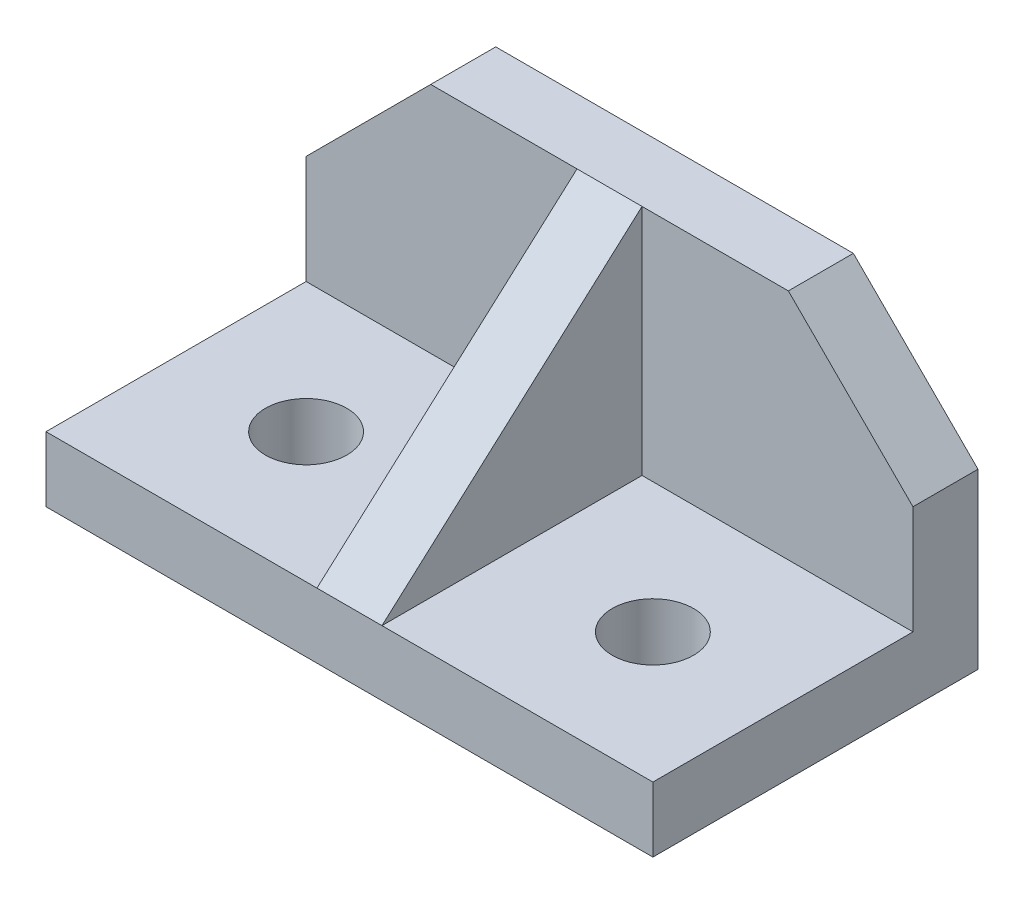
ISO-10303-21;
HEADER;
FILE_DESCRIPTION(('STEP AP214'),'2;1');
FILE_NAME('part.step','',(''),(''),'','','');
FILE_SCHEMA(('AUTOMOTIVE_DESIGN { 1 0 10303 214 1 1 1 1 }'));
ENDSEC;
DATA;
#1=APPLICATION_CONTEXT('core data for automotive mechanical design processes');
#2=APPLICATION_PROTOCOL_DEFINITION('international standard','automotive_design',2000,#1);
#3=PRODUCT_CONTEXT('',#1,'mechanical');
#4=PRODUCT('Part','Part','',(#3));
#5=PRODUCT_RELATED_PRODUCT_CATEGORY('part','',(#4));
#6=PRODUCT_DEFINITION_FORMATION('','',#4);
#7=PRODUCT_DEFINITION_CONTEXT('part definition',#1,'design');
#8=PRODUCT_DEFINITION('design','',#6,#7);
#9=PRODUCT_DEFINITION_SHAPE('','',#8);
#10=(LENGTH_UNIT() NAMED_UNIT(*) SI_UNIT(.MILLI.,.METRE.));
#11=(NAMED_UNIT(*) PLANE_ANGLE_UNIT() SI_UNIT($,.RADIAN.));
#12=(NAMED_UNIT(*) SI_UNIT($,.STERADIAN.) SOLID_ANGLE_UNIT());
#13=UNCERTAINTY_MEASURE_WITH_UNIT(LENGTH_MEASURE(1.E-05),#10,'distance_accuracy_value','');
#14=(GEOMETRIC_REPRESENTATION_CONTEXT(3) GLOBAL_UNCERTAINTY_ASSIGNED_CONTEXT((#13)) GLOBAL_UNIT_ASSIGNED_CONTEXT((#10,
#11,#12)) REPRESENTATION_CONTEXT('',''));
#15=CARTESIAN_POINT('',(0.,0.,0.));
#16=DIRECTION('',(0.,0.,1.));
#17=DIRECTION('',(1.,0.,0.));
#18=AXIS2_PLACEMENT_3D('',#15,#16,#17);
#19=CARTESIAN_POINT('',(0.,12.,0.));
#20=DIRECTION('',(0.,-1.,0.));
#21=DIRECTION('',(0.,0.,-1.));
#22=AXIS2_PLACEMENT_3D('',#19,#20,#21);
#23=PLANE('',#22);
#24=CARTESIAN_POINT('',(24.,12.,-24.));
#25=DIRECTION('',(0.,1.,0.));
#26=DIRECTION('',(0.,0.,1.));
#27=AXIS2_PLACEMENT_3D('',#24,#25,#26);
#28=CIRCLE('',#27,7.5);
#29=CARTESIAN_POINT('',(24.,12.,-16.5));
#30=VERTEX_POINT('',#29);
#31=EDGE_CURVE('E116',#30,#30,#28,.T.);
#32=ORIENTED_EDGE('',*,*,#31,.F.);
#33=EDGE_LOOP('',(#32));
#34=FACE_BOUND('',#33,.T.);
#35=DIRECTION('',(0.,0.,1.));
#36=VECTOR('',#35,1.);
#37=CARTESIAN_POINT('',(50.,12.,-48.));
#38=LINE('',#37,#36);
#39=CARTESIAN_POINT('',(50.,12.,-48.));
#40=VERTEX_POINT('',#39);
#41=CARTESIAN_POINT('',(50.,12.,0.));
#42=VERTEX_POINT('',#41);
#43=EDGE_CURVE('E425',#40,#42,#38,.T.);
#44=ORIENTED_EDGE('',*,*,#43,.F.);
#45=DIRECTION('',(-1.,0.,0.));
#46=VECTOR('',#45,1.);
#47=CARTESIAN_POINT('',(112.,12.,-48.));
#48=LINE('',#47,#46);
#49=CARTESIAN_POINT('',(0.,12.,-48.));
#50=VERTEX_POINT('',#49);
#51=EDGE_CURVE('E55',#40,#50,#48,.T.);
#52=ORIENTED_EDGE('',*,*,#51,.T.);
#53=DIRECTION('',(0.,0.,1.));
#54=VECTOR('',#53,1.);
#55=CARTESIAN_POINT('',(0.,12.,0.));
#56=LINE('',#55,#54);
#57=CARTESIAN_POINT('',(0.,12.,0.));
#58=VERTEX_POINT('',#57);
#59=EDGE_CURVE('E98',#50,#58,#56,.T.);
#60=ORIENTED_EDGE('',*,*,#59,.T.);
#61=DIRECTION('',(1.,0.,0.));
#62=VECTOR('',#61,1.);
#63=CARTESIAN_POINT('',(0.,12.,0.));
#64=LINE('',#63,#62);
#65=EDGE_CURVE('E142',#58,#42,#64,.T.);
#66=ORIENTED_EDGE('',*,*,#65,.T.);
#67=EDGE_LOOP('',(#44,#52,#60,#66));
#68=FACE_BOUND('',#67,.T.);
#69=ADVANCED_FACE('F39',(#34,#68),#23,.F.);
#70=CARTESIAN_POINT('',(88.,12.,-24.));
#71=DIRECTION('',(0.,1.,0.));
#72=DIRECTION('',(0.,0.,1.));
#73=AXIS2_PLACEMENT_3D('',#70,#71,#72);
#74=CIRCLE('',#73,7.50000000000001);
#75=CARTESIAN_POINT('',(88.,12.,-16.5));
#76=VERTEX_POINT('',#75);
#77=EDGE_CURVE('E240',#76,#76,#74,.T.);
#78=ORIENTED_EDGE('',*,*,#77,.F.);
#79=EDGE_LOOP('',(#78));
#80=FACE_BOUND('',#79,.T.);
#81=DIRECTION('',(0.,0.,-1.));
#82=VECTOR('',#81,1.);
#83=CARTESIAN_POINT('',(62.,12.,0.));
#84=LINE('',#83,#82);
#85=CARTESIAN_POINT('',(62.,12.,0.));
#86=VERTEX_POINT('',#85);
#87=CARTESIAN_POINT('',(62.,12.,-48.));
#88=VERTEX_POINT('',#87);
#89=EDGE_CURVE('E420',#86,#88,#84,.T.);
#90=ORIENTED_EDGE('',*,*,#89,.F.);
#91=CARTESIAN_POINT('',(112.,12.,0.));
#92=VERTEX_POINT('',#91);
#93=EDGE_CURVE('E64',#86,#92,#64,.T.);
#94=ORIENTED_EDGE('',*,*,#93,.T.);
#95=DIRECTION('',(0.,0.,-1.));
#96=VECTOR('',#95,1.);
#97=CARTESIAN_POINT('',(112.,12.,0.));
#98=LINE('',#97,#96);
#99=CARTESIAN_POINT('',(112.,12.,-48.));
#100=VERTEX_POINT('',#99);
#101=EDGE_CURVE('E110',#92,#100,#98,.T.);
#102=ORIENTED_EDGE('',*,*,#101,.T.);
#103=EDGE_CURVE('E157',#100,#88,#48,.T.);
#104=ORIENTED_EDGE('',*,*,#103,.T.);
#105=EDGE_LOOP('',(#90,#94,#102,#104));
#106=FACE_BOUND('',#105,.T.);
#107=ADVANCED_FACE('F154',(#80,#106),#23,.F.);
#108=CARTESIAN_POINT('',(0.,0.,-48.));
#109=DIRECTION('',(0.,0.,-1.));
#110=DIRECTION('',(-1.,0.,0.));
#111=AXIS2_PLACEMENT_3D('',#108,#109,#110);
#112=PLANE('',#111);
#113=DIRECTION('',(0.,-1.,0.));
#114=VECTOR('',#113,1.);
#115=CARTESIAN_POINT('',(50.,55.,-48.));
#116=LINE('',#115,#114);
#117=CARTESIAN_POINT('',(50.,55.,-48.));
#118=VERTEX_POINT('',#117);
#119=EDGE_CURVE('E228',#118,#40,#116,.T.);
#120=ORIENTED_EDGE('',*,*,#119,.F.);
#121=DIRECTION('',(1.,0.,0.));
#122=VECTOR('',#121,1.);
#123=CARTESIAN_POINT('',(22.9999999999999,55.,-48.));
#124=LINE('',#123,#122);
#125=CARTESIAN_POINT('',(22.9999999999999,55.,-48.));
#126=VERTEX_POINT('',#125);
#127=EDGE_CURVE('E202',#126,#118,#124,.T.);
#128=ORIENTED_EDGE('',*,*,#127,.F.);
#129=DIRECTION('',(0.707106781186546,0.707106781186549,0.));
#130=VECTOR('',#129,1.);
#131=CARTESIAN_POINT('',(0.,32.,-48.));
#132=LINE('',#131,#130);
#133=CARTESIAN_POINT('',(0.,32.,-48.));
#134=VERTEX_POINT('',#133);
#135=EDGE_CURVE('E203',#134,#126,#132,.T.);
#136=ORIENTED_EDGE('',*,*,#135,.F.);
#137=DIRECTION('',(0.,1.,0.));
#138=VECTOR('',#137,1.);
#139=CARTESIAN_POINT('',(0.,12.,-48.));
#140=LINE('',#139,#138);
#141=EDGE_CURVE('E145',#50,#134,#140,.T.);
#142=ORIENTED_EDGE('',*,*,#141,.F.);
#143=ORIENTED_EDGE('',*,*,#51,.F.);
#144=EDGE_LOOP('',(#120,#128,#136,#142,#143));
#145=FACE_BOUND('',#144,.T.);
#146=ADVANCED_FACE('F267',(#145),#112,.F.);
#147=DIRECTION('',(0.,-1.,0.));
#148=VECTOR('',#147,1.);
#149=CARTESIAN_POINT('',(62.,55.,-48.));
#150=LINE('',#149,#148);
#151=CARTESIAN_POINT('',(62.,55.,-48.));
#152=VERTEX_POINT('',#151);
#153=EDGE_CURVE('E421',#152,#88,#150,.T.);
#154=ORIENTED_EDGE('',*,*,#153,.T.);
#155=ORIENTED_EDGE('',*,*,#103,.F.);
#156=DIRECTION('',(0.,-1.,0.));
#157=VECTOR('',#156,1.);
#158=CARTESIAN_POINT('',(112.,32.,-48.));
#159=LINE('',#158,#157);
#160=CARTESIAN_POINT('',(112.,32.,-48.));
#161=VERTEX_POINT('',#160);
#162=EDGE_CURVE('E216',#161,#100,#159,.T.);
#163=ORIENTED_EDGE('',*,*,#162,.F.);
#164=DIRECTION('',(0.707106781186547,-0.707106781186548,0.));
#165=VECTOR('',#164,1.);
#166=CARTESIAN_POINT('',(89.0000000000001,55.,-48.));
#167=LINE('',#166,#165);
#168=CARTESIAN_POINT('',(89.0000000000001,55.,-48.));
#169=VERTEX_POINT('',#168);
#170=EDGE_CURVE('E208',#169,#161,#167,.T.);
#171=ORIENTED_EDGE('',*,*,#170,.F.);
#172=EDGE_CURVE('E189',#152,#169,#124,.T.);
#173=ORIENTED_EDGE('',*,*,#172,.F.);
#174=EDGE_LOOP('',(#154,#155,#163,#171,#173));
#175=FACE_BOUND('',#174,.T.);
#176=ADVANCED_FACE('F215',(#175),#112,.F.);
#177=CARTESIAN_POINT('',(0.,0.,0.));
#178=DIRECTION('',(0.,-1.,0.));
#179=DIRECTION('',(0.,0.,-1.));
#180=AXIS2_PLACEMENT_3D('',#177,#178,#179);
#181=PLANE('',#180);
#182=CARTESIAN_POINT('',(24.,0.,-24.));
#183=DIRECTION('',(0.,1.,0.));
#184=DIRECTION('',(0.,0.,1.));
#185=AXIS2_PLACEMENT_3D('',#182,#183,#184);
#186=CIRCLE('',#185,7.5);
#187=CARTESIAN_POINT('',(24.,0.,-16.5));
#188=VERTEX_POINT('',#187);
#189=EDGE_CURVE('E122',#188,#188,#186,.T.);
#190=ORIENTED_EDGE('',*,*,#189,.T.);
#191=EDGE_LOOP('',(#190));
#192=FACE_BOUND('',#191,.T.);
#193=DIRECTION('',(0.,0.,1.));
#194=VECTOR('',#193,1.);
#195=CARTESIAN_POINT('',(0.,0.,0.));
#196=LINE('',#195,#194);
#197=CARTESIAN_POINT('',(0.,0.,-60.));
#198=VERTEX_POINT('',#197);
#199=CARTESIAN_POINT('',(0.,0.,0.));
#200=VERTEX_POINT('',#199);
#201=EDGE_CURVE('E104',#198,#200,#196,.T.);
#202=ORIENTED_EDGE('',*,*,#201,.F.);
#203=DIRECTION('',(-1.,0.,0.));
#204=VECTOR('',#203,1.);
#205=CARTESIAN_POINT('',(0.,0.,-60.));
#206=LINE('',#205,#204);
#207=CARTESIAN_POINT('',(112.,0.,-60.));
#208=VERTEX_POINT('',#207);
#209=EDGE_CURVE('E84',#208,#198,#206,.T.);
#210=ORIENTED_EDGE('',*,*,#209,.F.);
#211=DIRECTION('',(0.,0.,-1.));
#212=VECTOR('',#211,1.);
#213=CARTESIAN_POINT('',(112.,0.,0.));
#214=LINE('',#213,#212);
#215=CARTESIAN_POINT('',(112.,0.,0.));
#216=VERTEX_POINT('',#215);
#217=EDGE_CURVE('E99',#216,#208,#214,.T.);
#218=ORIENTED_EDGE('',*,*,#217,.F.);
#219=DIRECTION('',(1.,0.,0.));
#220=VECTOR('',#219,1.);
#221=CARTESIAN_POINT('',(0.,0.,0.));
#222=LINE('',#221,#220);
#223=EDGE_CURVE('E114',#200,#216,#222,.T.);
#224=ORIENTED_EDGE('',*,*,#223,.F.);
#225=EDGE_LOOP('',(#202,#210,#218,#224));
#226=FACE_BOUND('',#225,.T.);
#227=CARTESIAN_POINT('',(88.,0.,-24.));
#228=DIRECTION('',(0.,1.,0.));
#229=DIRECTION('',(0.,0.,1.));
#230=AXIS2_PLACEMENT_3D('',#227,#228,#229);
#231=CIRCLE('',#230,7.50000000000001);
#232=CARTESIAN_POINT('',(88.,0.,-16.5));
#233=VERTEX_POINT('',#232);
#234=EDGE_CURVE('E234',#233,#233,#231,.T.);
#235=ORIENTED_EDGE('',*,*,#234,.T.);
#236=EDGE_LOOP('',(#235));
#237=FACE_BOUND('',#236,.T.);
#238=ADVANCED_FACE('F112',(#192,#226,#237),#181,.T.);
#239=CARTESIAN_POINT('',(0.,12.,0.));
#240=DIRECTION('',(1.,0.,0.));
#241=DIRECTION('',(0.,0.,-1.));
#242=AXIS2_PLACEMENT_3D('',#239,#240,#241);
#243=PLANE('',#242);
#244=ORIENTED_EDGE('',*,*,#201,.T.);
#245=DIRECTION('',(0.,-1.,0.));
#246=VECTOR('',#245,1.);
#247=CARTESIAN_POINT('',(0.,12.,0.));
#248=LINE('',#247,#246);
#249=EDGE_CURVE('E11',#58,#200,#248,.T.);
#250=ORIENTED_EDGE('',*,*,#249,.F.);
#251=ORIENTED_EDGE('',*,*,#59,.F.);
#252=ORIENTED_EDGE('',*,*,#141,.T.);
#253=DIRECTION('',(0.,0.,-1.));
#254=VECTOR('',#253,1.);
#255=CARTESIAN_POINT('',(0.,32.,-48.));
#256=LINE('',#255,#254);
#257=CARTESIAN_POINT('',(0.,32.,-60.));
#258=VERTEX_POINT('',#257);
#259=EDGE_CURVE('E107',#134,#258,#256,.T.);
#260=ORIENTED_EDGE('',*,*,#259,.T.);
#261=DIRECTION('',(0.,-1.,0.));
#262=VECTOR('',#261,1.);
#263=CARTESIAN_POINT('',(0.,12.,-60.));
#264=LINE('',#263,#262);
#265=EDGE_CURVE('E89',#258,#198,#264,.T.);
#266=ORIENTED_EDGE('',*,*,#265,.T.);
#267=EDGE_LOOP('',(#244,#250,#251,#252,#260,#266));
#268=FACE_BOUND('',#267,.T.);
#269=ADVANCED_FACE('F41',(#268),#243,.F.);
#270=CARTESIAN_POINT('',(0.,12.,0.));
#271=DIRECTION('',(0.,0.,-1.));
#272=DIRECTION('',(-1.,0.,0.));
#273=AXIS2_PLACEMENT_3D('',#270,#271,#272);
#274=PLANE('',#273);
#275=ORIENTED_EDGE('',*,*,#93,.F.);
#276=DIRECTION('',(1.,0.,0.));
#277=VECTOR('',#276,1.);
#278=CARTESIAN_POINT('',(-61.,12.,0.));
#279=LINE('',#278,#277);
#280=EDGE_CURVE('E410',#42,#86,#279,.T.);
#281=ORIENTED_EDGE('',*,*,#280,.F.);
#282=ORIENTED_EDGE('',*,*,#65,.F.);
#283=ORIENTED_EDGE('',*,*,#249,.T.);
#284=ORIENTED_EDGE('',*,*,#223,.T.);
#285=DIRECTION('',(0.,-1.,0.));
#286=VECTOR('',#285,1.);
#287=CARTESIAN_POINT('',(112.,12.,0.));
#288=LINE('',#287,#286);
#289=EDGE_CURVE('E48',#92,#216,#288,.T.);
#290=ORIENTED_EDGE('',*,*,#289,.F.);
#291=EDGE_LOOP('',(#275,#281,#282,#283,#284,#290));
#292=FACE_BOUND('',#291,.T.);
#293=ADVANCED_FACE('F137',(#292),#274,.F.);
#294=CARTESIAN_POINT('',(112.,12.,0.));
#295=DIRECTION('',(-1.,0.,0.));
#296=DIRECTION('',(0.,0.,1.));
#297=AXIS2_PLACEMENT_3D('',#294,#295,#296);
#298=PLANE('',#297);
#299=ORIENTED_EDGE('',*,*,#217,.T.);
#300=DIRECTION('',(0.,-1.,0.));
#301=VECTOR('',#300,1.);
#302=CARTESIAN_POINT('',(112.,12.,-60.));
#303=LINE('',#302,#301);
#304=CARTESIAN_POINT('',(112.,32.,-60.));
#305=VERTEX_POINT('',#304);
#306=EDGE_CURVE('E93',#305,#208,#303,.T.);
#307=ORIENTED_EDGE('',*,*,#306,.F.);
#308=DIRECTION('',(0.,0.,-1.));
#309=VECTOR('',#308,1.);
#310=CARTESIAN_POINT('',(112.,32.,-48.));
#311=LINE('',#310,#309);
#312=EDGE_CURVE('E212',#161,#305,#311,.T.);
#313=ORIENTED_EDGE('',*,*,#312,.F.);
#314=ORIENTED_EDGE('',*,*,#162,.T.);
#315=ORIENTED_EDGE('',*,*,#101,.F.);
#316=ORIENTED_EDGE('',*,*,#289,.T.);
#317=EDGE_LOOP('',(#299,#307,#313,#314,#315,#316));
#318=FACE_BOUND('',#317,.T.);
#319=ADVANCED_FACE('F134',(#318),#298,.F.);
#320=CARTESIAN_POINT('',(0.,12.,-60.));
#321=DIRECTION('',(0.,0.,1.));
#322=DIRECTION('',(1.,0.,0.));
#323=AXIS2_PLACEMENT_3D('',#320,#321,#322);
#324=PLANE('',#323);
#325=ORIENTED_EDGE('',*,*,#209,.T.);
#326=ORIENTED_EDGE('',*,*,#265,.F.);
#327=DIRECTION('',(0.707106781186546,0.707106781186549,0.));
#328=VECTOR('',#327,1.);
#329=CARTESIAN_POINT('',(0.,32.,-60.));
#330=LINE('',#329,#328);
#331=CARTESIAN_POINT('',(22.9999999999999,55.,-60.));
#332=VERTEX_POINT('',#331);
#333=EDGE_CURVE('E224',#258,#332,#330,.T.);
#334=ORIENTED_EDGE('',*,*,#333,.T.);
#335=DIRECTION('',(1.,0.,0.));
#336=VECTOR('',#335,1.);
#337=CARTESIAN_POINT('',(22.9999999999999,55.,-60.));
#338=LINE('',#337,#336);
#339=CARTESIAN_POINT('',(89.0000000000001,55.,-60.));
#340=VERTEX_POINT('',#339);
#341=EDGE_CURVE('E227',#332,#340,#338,.T.);
#342=ORIENTED_EDGE('',*,*,#341,.T.);
#343=DIRECTION('',(0.707106781186547,-0.707106781186548,0.));
#344=VECTOR('',#343,1.);
#345=CARTESIAN_POINT('',(89.0000000000001,55.,-60.));
#346=LINE('',#345,#344);
#347=EDGE_CURVE('E209',#340,#305,#346,.T.);
#348=ORIENTED_EDGE('',*,*,#347,.T.);
#349=ORIENTED_EDGE('',*,*,#306,.T.);
#350=EDGE_LOOP('',(#325,#326,#334,#342,#348,#349));
#351=FACE_BOUND('',#350,.T.);
#352=ADVANCED_FACE('F86',(#351),#324,.F.);
#353=CARTESIAN_POINT('',(24.,12.,-24.));
#354=DIRECTION('',(0.,-1.,0.));
#355=DIRECTION('',(0.,0.,-1.));
#356=AXIS2_PLACEMENT_3D('',#353,#354,#355);
#357=CYLINDRICAL_SURFACE('',#356,7.5);
#358=ORIENTED_EDGE('',*,*,#31,.T.);
#359=EDGE_LOOP('',(#358));
#360=FACE_BOUND('',#359,.T.);
#361=ORIENTED_EDGE('',*,*,#189,.F.);
#362=EDGE_LOOP('',(#361));
#363=FACE_BOUND('',#362,.T.);
#364=ADVANCED_FACE('F250',(#360,#363),#357,.F.);
#365=CARTESIAN_POINT('',(88.,12.,-24.));
#366=DIRECTION('',(0.,-1.,0.));
#367=DIRECTION('',(0.,0.,-1.));
#368=AXIS2_PLACEMENT_3D('',#365,#366,#367);
#369=CYLINDRICAL_SURFACE('',#368,7.50000000000001);
#370=ORIENTED_EDGE('',*,*,#77,.T.);
#371=EDGE_LOOP('',(#370));
#372=FACE_BOUND('',#371,.T.);
#373=ORIENTED_EDGE('',*,*,#234,.F.);
#374=EDGE_LOOP('',(#373));
#375=FACE_BOUND('',#374,.T.);
#376=ADVANCED_FACE('F248',(#372,#375),#369,.F.);
#377=CARTESIAN_POINT('',(89.0000000000001,55.,-48.));
#378=DIRECTION('',(0.707106781186548,0.707106781186547,0.));
#379=DIRECTION('',(-0.707106781186547,0.707106781186548,0.));
#380=AXIS2_PLACEMENT_3D('',#377,#378,#379);
#381=PLANE('',#380);
#382=ORIENTED_EDGE('',*,*,#347,.F.);
#383=DIRECTION('',(0.,0.,-1.));
#384=VECTOR('',#383,1.);
#385=CARTESIAN_POINT('',(89.0000000000001,55.,-48.));
#386=LINE('',#385,#384);
#387=EDGE_CURVE('E193',#169,#340,#386,.T.);
#388=ORIENTED_EDGE('',*,*,#387,.F.);
#389=ORIENTED_EDGE('',*,*,#170,.T.);
#390=ORIENTED_EDGE('',*,*,#312,.T.);
#391=EDGE_LOOP('',(#382,#388,#389,#390));
#392=FACE_BOUND('',#391,.T.);
#393=ADVANCED_FACE('F207',(#392),#381,.T.);
#394=CARTESIAN_POINT('',(22.9999999999999,55.,-48.));
#395=DIRECTION('',(0.,1.,0.));
#396=DIRECTION('',(-1.,0.,0.));
#397=AXIS2_PLACEMENT_3D('',#394,#395,#396);
#398=PLANE('',#397);
#399=DIRECTION('',(1.,0.,0.));
#400=VECTOR('',#399,1.);
#401=CARTESIAN_POINT('',(-61.,55.,-48.));
#402=LINE('',#401,#400);
#403=EDGE_CURVE('E198',#118,#152,#402,.T.);
#404=ORIENTED_EDGE('',*,*,#403,.T.);
#405=ORIENTED_EDGE('',*,*,#172,.T.);
#406=ORIENTED_EDGE('',*,*,#387,.T.);
#407=ORIENTED_EDGE('',*,*,#341,.F.);
#408=DIRECTION('',(0.,0.,-1.));
#409=VECTOR('',#408,1.);
#410=CARTESIAN_POINT('',(22.9999999999999,55.,-48.));
#411=LINE('',#410,#409);
#412=EDGE_CURVE('E213',#126,#332,#411,.T.);
#413=ORIENTED_EDGE('',*,*,#412,.F.);
#414=ORIENTED_EDGE('',*,*,#127,.T.);
#415=EDGE_LOOP('',(#404,#405,#406,#407,#413,#414));
#416=FACE_BOUND('',#415,.T.);
#417=ADVANCED_FACE('F191',(#416),#398,.T.);
#418=CARTESIAN_POINT('',(0.,32.,-48.));
#419=DIRECTION('',(-0.707106781186549,0.707106781186546,0.));
#420=DIRECTION('',(-0.707106781186546,-0.707106781186549,0.));
#421=AXIS2_PLACEMENT_3D('',#418,#419,#420);
#422=PLANE('',#421);
#423=ORIENTED_EDGE('',*,*,#333,.F.);
#424=ORIENTED_EDGE('',*,*,#259,.F.);
#425=ORIENTED_EDGE('',*,*,#135,.T.);
#426=ORIENTED_EDGE('',*,*,#412,.T.);
#427=EDGE_LOOP('',(#423,#424,#425,#426));
#428=FACE_BOUND('',#427,.T.);
#429=ADVANCED_FACE('F315',(#428),#422,.T.);
#430=CARTESIAN_POINT('',(50.,55.,-48.));
#431=DIRECTION('',(1.,0.,0.));
#432=DIRECTION('',(0.,0.,-1.));
#433=AXIS2_PLACEMENT_3D('',#430,#431,#432);
#434=PLANE('',#433);
#435=ORIENTED_EDGE('',*,*,#43,.T.);
#436=DIRECTION('',(0.,0.667248321585239,-0.744835335723058));
#437=VECTOR('',#436,1.);
#438=CARTESIAN_POINT('',(50.,55.,-48.));
#439=LINE('',#438,#437);
#440=EDGE_CURVE('E414',#42,#118,#439,.T.);
#441=ORIENTED_EDGE('',*,*,#440,.T.);
#442=ORIENTED_EDGE('',*,*,#119,.T.);
#443=EDGE_LOOP('',(#435,#441,#442));
#444=FACE_BOUND('',#443,.T.);
#445=ADVANCED_FACE('F320',(#444),#434,.F.);
#446=CARTESIAN_POINT('',(62.,55.,0.));
#447=DIRECTION('',(-1.,0.,0.));
#448=DIRECTION('',(0.,0.,1.));
#449=AXIS2_PLACEMENT_3D('',#446,#447,#448);
#450=PLANE('',#449);
#451=ORIENTED_EDGE('',*,*,#153,.F.);
#452=DIRECTION('',(0.,0.667248321585239,-0.744835335723058));
#453=VECTOR('',#452,1.);
#454=CARTESIAN_POINT('',(62.,55.,-48.));
#455=LINE('',#454,#453);
#456=EDGE_CURVE('E412',#86,#152,#455,.T.);
#457=ORIENTED_EDGE('',*,*,#456,.F.);
#458=ORIENTED_EDGE('',*,*,#89,.T.);
#459=EDGE_LOOP('',(#451,#457,#458));
#460=FACE_BOUND('',#459,.T.);
#461=ADVANCED_FACE('F384',(#460),#450,.F.);
#462=CARTESIAN_POINT('',(-61.,55.,-48.));
#463=DIRECTION('',(0.,-0.744835335723058,-0.667248321585239));
#464=DIRECTION('',(0.,0.667248321585239,-0.744835335723058));
#465=AXIS2_PLACEMENT_3D('',#462,#463,#464);
#466=PLANE('',#465);
#467=ORIENTED_EDGE('',*,*,#280,.T.);
#468=ORIENTED_EDGE('',*,*,#456,.T.);
#469=ORIENTED_EDGE('',*,*,#403,.F.);
#470=ORIENTED_EDGE('',*,*,#440,.F.);
#471=EDGE_LOOP('',(#467,#468,#469,#470));
#472=FACE_BOUND('',#471,.T.);
#473=ADVANCED_FACE('F393',(#472),#466,.F.);
#474=CLOSED_SHELL('',(#69,#107,#146,#176,#238,#269,#293,#319,#352,#364,#376,#393,#417,#429,#445,
#461,#473));
#475=MANIFOLD_SOLID_BREP('B2',#474);
#476=ADVANCED_BREP_SHAPE_REPRESENTATION('',(#18,#475),#14);
#477=SHAPE_DEFINITION_REPRESENTATION(#9,#476);
ENDSEC;
END-ISO-10303-21;
